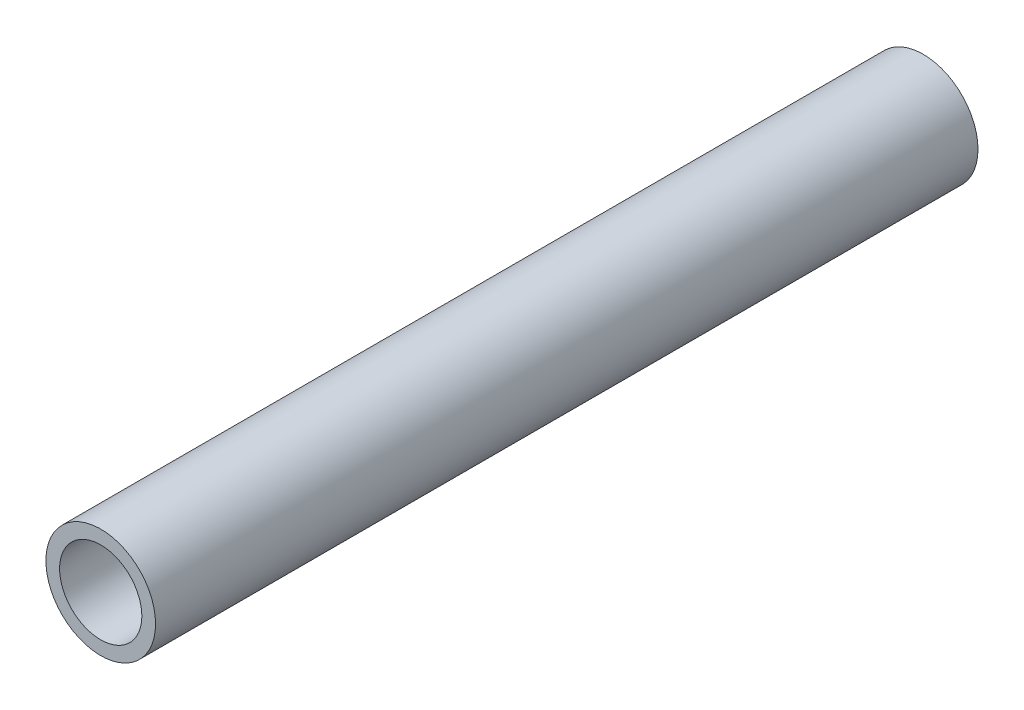
ISO-10303-21;
HEADER;
FILE_DESCRIPTION(('STEP AP214'),'2;1');
FILE_NAME('part.step','',(''),(''),'','','');
FILE_SCHEMA(('AUTOMOTIVE_DESIGN { 1 0 10303 214 1 1 1 1 }'));
ENDSEC;
DATA;
#1=APPLICATION_CONTEXT('core data for automotive mechanical design processes');
#2=APPLICATION_PROTOCOL_DEFINITION('international standard','automotive_design',2000,#1);
#3=PRODUCT_CONTEXT('',#1,'mechanical');
#4=PRODUCT('Part','Part','',(#3));
#5=PRODUCT_RELATED_PRODUCT_CATEGORY('part','',(#4));
#6=PRODUCT_DEFINITION_FORMATION('','',#4);
#7=PRODUCT_DEFINITION_CONTEXT('part definition',#1,'design');
#8=PRODUCT_DEFINITION('design','',#6,#7);
#9=PRODUCT_DEFINITION_SHAPE('','',#8);
#10=(LENGTH_UNIT() NAMED_UNIT(*) SI_UNIT(.MILLI.,.METRE.));
#11=(NAMED_UNIT(*) PLANE_ANGLE_UNIT() SI_UNIT($,.RADIAN.));
#12=(NAMED_UNIT(*) SI_UNIT($,.STERADIAN.) SOLID_ANGLE_UNIT());
#13=UNCERTAINTY_MEASURE_WITH_UNIT(LENGTH_MEASURE(1.E-05),#10,'distance_accuracy_value','');
#14=(GEOMETRIC_REPRESENTATION_CONTEXT(3) GLOBAL_UNCERTAINTY_ASSIGNED_CONTEXT((#13)) GLOBAL_UNIT_ASSIGNED_CONTEXT((#10,
#11,#12)) REPRESENTATION_CONTEXT('',''));
#15=CARTESIAN_POINT('',(0.,0.,0.));
#16=DIRECTION('',(0.,0.,1.));
#17=DIRECTION('',(1.,0.,0.));
#18=AXIS2_PLACEMENT_3D('',#15,#16,#17);
#19=CARTESIAN_POINT('',(0.,0.,190.5));
#20=DIRECTION('',(0.,0.,1.));
#21=DIRECTION('',(1.,0.,0.));
#22=AXIS2_PLACEMENT_3D('',#19,#20,#21);
#23=PLANE('',#22);
#24=CARTESIAN_POINT('',(0.,0.,190.5));
#25=DIRECTION('',(0.,0.,1.));
#26=DIRECTION('',(1.,0.,0.));
#27=AXIS2_PLACEMENT_3D('',#24,#25,#26);
#28=CIRCLE('',#27,12.7);
#29=CARTESIAN_POINT('',(12.7,0.,190.5));
#30=VERTEX_POINT('',#29);
#31=EDGE_CURVE('E12',#30,#30,#28,.T.);
#32=ORIENTED_EDGE('',*,*,#31,.T.);
#33=EDGE_LOOP('',(#32));
#34=FACE_BOUND('',#33,.T.);
#35=CARTESIAN_POINT('',(0.,0.,190.5));
#36=DIRECTION('',(0.,0.,1.));
#37=DIRECTION('',(1.,0.,0.));
#38=AXIS2_PLACEMENT_3D('',#35,#36,#37);
#39=CIRCLE('',#38,9.525);
#40=CARTESIAN_POINT('',(9.525,0.,190.5));
#41=VERTEX_POINT('',#40);
#42=EDGE_CURVE('E51',#41,#41,#39,.T.);
#43=ORIENTED_EDGE('',*,*,#42,.F.);
#44=EDGE_LOOP('',(#43));
#45=FACE_BOUND('',#44,.T.);
#46=ADVANCED_FACE('F40',(#34,#45),#23,.T.);
#47=CARTESIAN_POINT('',(0.,0.,0.));
#48=DIRECTION('',(0.,0.,1.));
#49=DIRECTION('',(1.,0.,0.));
#50=AXIS2_PLACEMENT_3D('',#47,#48,#49);
#51=PLANE('',#50);
#52=CARTESIAN_POINT('',(0.,0.,0.));
#53=DIRECTION('',(0.,0.,1.));
#54=DIRECTION('',(1.,0.,0.));
#55=AXIS2_PLACEMENT_3D('',#52,#53,#54);
#56=CIRCLE('',#55,12.7);
#57=CARTESIAN_POINT('',(12.7,0.,0.));
#58=VERTEX_POINT('',#57);
#59=EDGE_CURVE('E44',#58,#58,#56,.T.);
#60=ORIENTED_EDGE('',*,*,#59,.F.);
#61=EDGE_LOOP('',(#60));
#62=FACE_BOUND('',#61,.T.);
#63=CARTESIAN_POINT('',(0.,0.,0.));
#64=DIRECTION('',(0.,0.,1.));
#65=DIRECTION('',(1.,0.,0.));
#66=AXIS2_PLACEMENT_3D('',#63,#64,#65);
#67=CIRCLE('',#66,9.525);
#68=CARTESIAN_POINT('',(9.525,0.,0.));
#69=VERTEX_POINT('',#68);
#70=EDGE_CURVE('E53',#69,#69,#67,.T.);
#71=ORIENTED_EDGE('',*,*,#70,.T.);
#72=EDGE_LOOP('',(#71));
#73=FACE_BOUND('',#72,.T.);
#74=ADVANCED_FACE('F63',(#62,#73),#51,.F.);
#75=CARTESIAN_POINT('',(0.,0.,190.5));
#76=DIRECTION('',(0.,0.,-1.));
#77=DIRECTION('',(-1.,0.,0.));
#78=AXIS2_PLACEMENT_3D('',#75,#76,#77);
#79=CYLINDRICAL_SURFACE('',#78,12.7);
#80=ORIENTED_EDGE('',*,*,#31,.F.);
#81=EDGE_LOOP('',(#80));
#82=FACE_BOUND('',#81,.T.);
#83=ORIENTED_EDGE('',*,*,#59,.T.);
#84=EDGE_LOOP('',(#83));
#85=FACE_BOUND('',#84,.T.);
#86=ADVANCED_FACE('F42',(#82,#85),#79,.T.);
#87=CARTESIAN_POINT('',(0.,0.,190.5));
#88=DIRECTION('',(0.,0.,-1.));
#89=DIRECTION('',(-1.,0.,0.));
#90=AXIS2_PLACEMENT_3D('',#87,#88,#89);
#91=CYLINDRICAL_SURFACE('',#90,9.525);
#92=ORIENTED_EDGE('',*,*,#42,.T.);
#93=EDGE_LOOP('',(#92));
#94=FACE_BOUND('',#93,.T.);
#95=ORIENTED_EDGE('',*,*,#70,.F.);
#96=EDGE_LOOP('',(#95));
#97=FACE_BOUND('',#96,.T.);
#98=ADVANCED_FACE('F59',(#94,#97),#91,.F.);
#99=CLOSED_SHELL('',(#46,#74,#86,#98));
#100=MANIFOLD_SOLID_BREP('B2',#99);
#101=ADVANCED_BREP_SHAPE_REPRESENTATION('',(#18,#100),#14);
#102=SHAPE_DEFINITION_REPRESENTATION(#9,#101);
ENDSEC;
END-ISO-10303-21;
